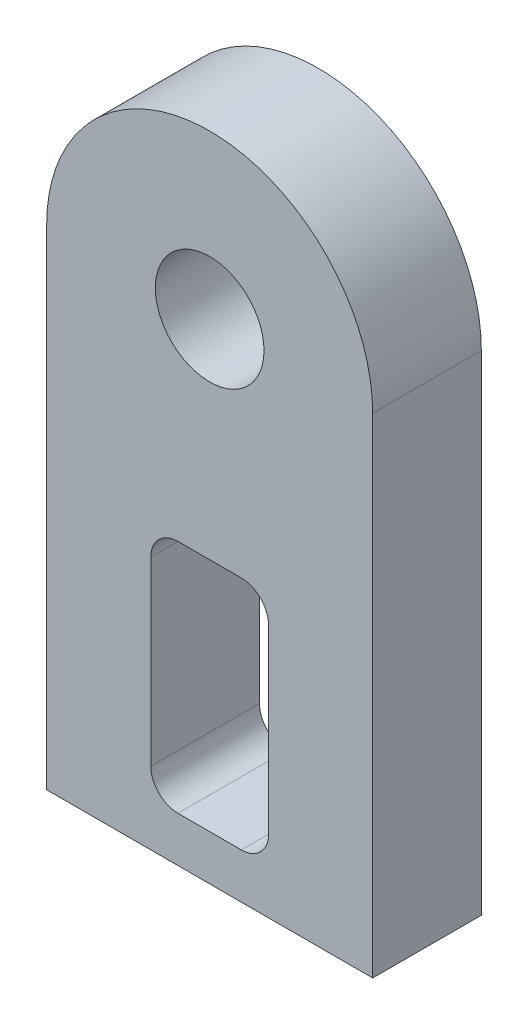
ISO-10303-21;
HEADER;
FILE_DESCRIPTION(('STEP AP214'),'2;1');
FILE_NAME('part.step','',(''),(''),'','','');
FILE_SCHEMA(('AUTOMOTIVE_DESIGN { 1 0 10303 214 1 1 1 1 }'));
ENDSEC;
DATA;
#1=APPLICATION_CONTEXT('core data for automotive mechanical design processes');
#2=APPLICATION_PROTOCOL_DEFINITION('international standard','automotive_design',2000,#1);
#3=PRODUCT_CONTEXT('',#1,'mechanical');
#4=PRODUCT('Part','Part','',(#3));
#5=PRODUCT_RELATED_PRODUCT_CATEGORY('part','',(#4));
#6=PRODUCT_DEFINITION_FORMATION('','',#4);
#7=PRODUCT_DEFINITION_CONTEXT('part definition',#1,'design');
#8=PRODUCT_DEFINITION('design','',#6,#7);
#9=PRODUCT_DEFINITION_SHAPE('','',#8);
#10=(LENGTH_UNIT() NAMED_UNIT(*) SI_UNIT(.MILLI.,.METRE.));
#11=(NAMED_UNIT(*) PLANE_ANGLE_UNIT() SI_UNIT($,.RADIAN.));
#12=(NAMED_UNIT(*) SI_UNIT($,.STERADIAN.) SOLID_ANGLE_UNIT());
#13=UNCERTAINTY_MEASURE_WITH_UNIT(LENGTH_MEASURE(1.E-05),#10,'distance_accuracy_value','');
#14=(GEOMETRIC_REPRESENTATION_CONTEXT(3) GLOBAL_UNCERTAINTY_ASSIGNED_CONTEXT((#13)) GLOBAL_UNIT_ASSIGNED_CONTEXT((#10,
#11,#12)) REPRESENTATION_CONTEXT('',''));
#15=CARTESIAN_POINT('',(0.,0.,0.));
#16=DIRECTION('',(0.,0.,1.));
#17=DIRECTION('',(1.,0.,0.));
#18=AXIS2_PLACEMENT_3D('',#15,#16,#17);
#19=CARTESIAN_POINT('',(155.0913565475,212.4940368431,3.));
#20=DIRECTION('',(0.,0.,1.));
#21=DIRECTION('',(1.,0.,0.));
#22=AXIS2_PLACEMENT_3D('',#19,#20,#21);
#23=PLANE('',#22);
#24=CARTESIAN_POINT('',(155.0913565475,212.4940368431,3.));
#25=DIRECTION('',(0.,0.,1.));
#26=DIRECTION('',(1.,0.,0.));
#27=AXIS2_PLACEMENT_3D('',#24,#25,#26);
#28=CIRCLE('',#27,1.5);
#29=CARTESIAN_POINT('',(156.5913565475,212.4940368431,3.));
#30=VERTEX_POINT('',#29);
#31=EDGE_CURVE('E187',#30,#30,#28,.T.);
#32=ORIENTED_EDGE('',*,*,#31,.F.);
#33=EDGE_LOOP('',(#32));
#34=FACE_BOUND('',#33,.T.);
#35=CARTESIAN_POINT('',(155.0913565475,212.4940368431,3.));
#36=DIRECTION('',(0.,0.,1.));
#37=DIRECTION('',(1.,0.,0.));
#38=AXIS2_PLACEMENT_3D('',#35,#36,#37);
#39=CIRCLE('',#38,4.5);
#40=CARTESIAN_POINT('',(159.5913565475,212.4940368431,3.));
#41=VERTEX_POINT('',#40);
#42=CARTESIAN_POINT('',(150.5913565475,212.4940368431,3.));
#43=VERTEX_POINT('',#42);
#44=EDGE_CURVE('E193',#41,#43,#39,.T.);
#45=ORIENTED_EDGE('',*,*,#44,.T.);
#46=DIRECTION('',(0.,-1.,0.));
#47=VECTOR('',#46,1.);
#48=CARTESIAN_POINT('',(150.5913565475,198.9940368431,3.));
#49=LINE('',#48,#47);
#50=CARTESIAN_POINT('',(150.5913565475,198.9940368431,3.));
#51=VERTEX_POINT('',#50);
#52=EDGE_CURVE('E196',#43,#51,#49,.T.);
#53=ORIENTED_EDGE('',*,*,#52,.T.);
#54=DIRECTION('',(1.,0.,0.));
#55=VECTOR('',#54,1.);
#56=CARTESIAN_POINT('',(159.5913565475,198.9940368431,3.));
#57=LINE('',#56,#55);
#58=CARTESIAN_POINT('',(159.5913565475,198.9940368431,3.));
#59=VERTEX_POINT('',#58);
#60=EDGE_CURVE('E199',#51,#59,#57,.T.);
#61=ORIENTED_EDGE('',*,*,#60,.T.);
#62=DIRECTION('',(0.,1.,0.));
#63=VECTOR('',#62,1.);
#64=CARTESIAN_POINT('',(159.5913565475,212.4940368431,3.));
#65=LINE('',#64,#63);
#66=EDGE_CURVE('E201',#59,#41,#65,.T.);
#67=ORIENTED_EDGE('',*,*,#66,.T.);
#68=EDGE_LOOP('',(#45,#53,#61,#67));
#69=FACE_BOUND('',#68,.T.);
#70=DIRECTION('',(0.,-1.,0.));
#71=VECTOR('',#70,1.);
#72=CARTESIAN_POINT('',(153.4663565475,200.9940368431,3.));
#73=LINE('',#72,#71);
#74=CARTESIAN_POINT('',(153.4663565475,205.9940368431,3.));
#75=VERTEX_POINT('',#74);
#76=CARTESIAN_POINT('',(153.4663565475,200.9940368431,3.));
#77=VERTEX_POINT('',#76);
#78=EDGE_CURVE('E130',#75,#77,#73,.T.);
#79=ORIENTED_EDGE('',*,*,#78,.F.);
#80=CARTESIAN_POINT('',(154.2163565475,205.9940368431,3.));
#81=DIRECTION('',(0.,0.,1.));
#82=DIRECTION('',(1.,0.,0.));
#83=AXIS2_PLACEMENT_3D('',#80,#81,#82);
#84=CIRCLE('',#83,0.750000000000001);
#85=CARTESIAN_POINT('',(154.2163565475,206.7440368431,3.));
#86=VERTEX_POINT('',#85);
#87=EDGE_CURVE('E122',#86,#75,#84,.T.);
#88=ORIENTED_EDGE('',*,*,#87,.F.);
#89=DIRECTION('',(-1.,0.,0.));
#90=VECTOR('',#89,1.);
#91=CARTESIAN_POINT('',(154.2163565475,206.7440368431,3.));
#92=LINE('',#91,#90);
#93=CARTESIAN_POINT('',(155.9663565475,206.7440368431,3.));
#94=VERTEX_POINT('',#93);
#95=EDGE_CURVE('E155',#94,#86,#92,.T.);
#96=ORIENTED_EDGE('',*,*,#95,.F.);
#97=CARTESIAN_POINT('',(155.9663565475,205.9940368431,3.));
#98=DIRECTION('',(0.,0.,1.));
#99=DIRECTION('',(1.,0.,0.));
#100=AXIS2_PLACEMENT_3D('',#97,#98,#99);
#101=CIRCLE('',#100,0.750000000000001);
#102=CARTESIAN_POINT('',(156.7163565475,205.9940368431,3.));
#103=VERTEX_POINT('',#102);
#104=EDGE_CURVE('E153',#103,#94,#101,.T.);
#105=ORIENTED_EDGE('',*,*,#104,.F.);
#106=DIRECTION('',(0.,1.,0.));
#107=VECTOR('',#106,1.);
#108=CARTESIAN_POINT('',(156.7163565475,205.9940368431,3.));
#109=LINE('',#108,#107);
#110=CARTESIAN_POINT('',(156.7163565475,200.9940368431,3.));
#111=VERTEX_POINT('',#110);
#112=EDGE_CURVE('E151',#111,#103,#109,.T.);
#113=ORIENTED_EDGE('',*,*,#112,.F.);
#114=CARTESIAN_POINT('',(155.9663565475,200.9940368431,3.));
#115=DIRECTION('',(0.,0.,1.));
#116=DIRECTION('',(1.,0.,0.));
#117=AXIS2_PLACEMENT_3D('',#114,#115,#116);
#118=CIRCLE('',#117,0.750000000000001);
#119=CARTESIAN_POINT('',(155.9663565475,200.2440368431,3.));
#120=VERTEX_POINT('',#119);
#121=EDGE_CURVE('E149',#120,#111,#118,.T.);
#122=ORIENTED_EDGE('',*,*,#121,.F.);
#123=DIRECTION('',(1.,0.,0.));
#124=VECTOR('',#123,1.);
#125=CARTESIAN_POINT('',(155.9663565475,200.2440368431,3.));
#126=LINE('',#125,#124);
#127=CARTESIAN_POINT('',(154.2163565475,200.2440368431,3.));
#128=VERTEX_POINT('',#127);
#129=EDGE_CURVE('E145',#128,#120,#126,.T.);
#130=ORIENTED_EDGE('',*,*,#129,.F.);
#131=CARTESIAN_POINT('',(154.2163565475,200.9940368431,3.));
#132=DIRECTION('',(0.,0.,1.));
#133=DIRECTION('',(1.,0.,0.));
#134=AXIS2_PLACEMENT_3D('',#131,#132,#133);
#135=CIRCLE('',#134,0.750000000000001);
#136=EDGE_CURVE('E143',#77,#128,#135,.T.);
#137=ORIENTED_EDGE('',*,*,#136,.F.);
#138=EDGE_LOOP('',(#79,#88,#96,#105,#113,#122,#130,#137));
#139=FACE_BOUND('',#138,.T.);
#140=ADVANCED_FACE('F33',(#34,#69,#139),#23,.T.);
#141=CARTESIAN_POINT('',(155.0913565475,212.4940368431,0.));
#142=DIRECTION('',(0.,0.,1.));
#143=DIRECTION('',(1.,0.,0.));
#144=AXIS2_PLACEMENT_3D('',#141,#142,#143);
#145=PLANE('',#144);
#146=CARTESIAN_POINT('',(155.0913565475,212.4940368431,0.));
#147=DIRECTION('',(0.,0.,1.));
#148=DIRECTION('',(1.,0.,0.));
#149=AXIS2_PLACEMENT_3D('',#146,#147,#148);
#150=CIRCLE('',#149,1.5);
#151=CARTESIAN_POINT('',(156.5913565475,212.4940368431,0.));
#152=VERTEX_POINT('',#151);
#153=EDGE_CURVE('E138',#152,#152,#150,.T.);
#154=ORIENTED_EDGE('',*,*,#153,.T.);
#155=EDGE_LOOP('',(#154));
#156=FACE_BOUND('',#155,.T.);
#157=CARTESIAN_POINT('',(155.0913565475,212.4940368431,0.));
#158=DIRECTION('',(0.,0.,1.));
#159=DIRECTION('',(1.,0.,0.));
#160=AXIS2_PLACEMENT_3D('',#157,#158,#159);
#161=CIRCLE('',#160,4.5);
#162=CARTESIAN_POINT('',(159.5913565475,212.4940368431,0.));
#163=VERTEX_POINT('',#162);
#164=CARTESIAN_POINT('',(150.5913565475,212.4940368431,0.));
#165=VERTEX_POINT('',#164);
#166=EDGE_CURVE('E190',#163,#165,#161,.T.);
#167=ORIENTED_EDGE('',*,*,#166,.F.);
#168=DIRECTION('',(0.,1.,0.));
#169=VECTOR('',#168,1.);
#170=CARTESIAN_POINT('',(159.5913565475,212.4940368431,0.));
#171=LINE('',#170,#169);
#172=CARTESIAN_POINT('',(159.5913565475,198.9940368431,0.));
#173=VERTEX_POINT('',#172);
#174=EDGE_CURVE('E197',#173,#163,#171,.T.);
#175=ORIENTED_EDGE('',*,*,#174,.F.);
#176=DIRECTION('',(1.,0.,0.));
#177=VECTOR('',#176,1.);
#178=CARTESIAN_POINT('',(159.5913565475,198.9940368431,0.));
#179=LINE('',#178,#177);
#180=CARTESIAN_POINT('',(150.5913565475,198.9940368431,0.));
#181=VERTEX_POINT('',#180);
#182=EDGE_CURVE('E208',#181,#173,#179,.T.);
#183=ORIENTED_EDGE('',*,*,#182,.F.);
#184=DIRECTION('',(0.,-1.,0.));
#185=VECTOR('',#184,1.);
#186=CARTESIAN_POINT('',(150.5913565475,198.9940368431,0.));
#187=LINE('',#186,#185);
#188=EDGE_CURVE('E206',#165,#181,#187,.T.);
#189=ORIENTED_EDGE('',*,*,#188,.F.);
#190=EDGE_LOOP('',(#167,#175,#183,#189));
#191=FACE_BOUND('',#190,.T.);
#192=CARTESIAN_POINT('',(154.2163565475,205.9940368431,0.));
#193=DIRECTION('',(0.,0.,1.));
#194=DIRECTION('',(1.,0.,0.));
#195=AXIS2_PLACEMENT_3D('',#192,#193,#194);
#196=CIRCLE('',#195,0.750000000000001);
#197=CARTESIAN_POINT('',(154.2163565475,206.7440368431,0.));
#198=VERTEX_POINT('',#197);
#199=CARTESIAN_POINT('',(153.4663565475,205.9940368431,0.));
#200=VERTEX_POINT('',#199);
#201=EDGE_CURVE('E56',#198,#200,#196,.T.);
#202=ORIENTED_EDGE('',*,*,#201,.T.);
#203=DIRECTION('',(0.,-1.,0.));
#204=VECTOR('',#203,1.);
#205=CARTESIAN_POINT('',(153.4663565475,200.9940368431,0.));
#206=LINE('',#205,#204);
#207=CARTESIAN_POINT('',(153.4663565475,200.9940368431,0.));
#208=VERTEX_POINT('',#207);
#209=EDGE_CURVE('E137',#200,#208,#206,.T.);
#210=ORIENTED_EDGE('',*,*,#209,.T.);
#211=CARTESIAN_POINT('',(154.2163565475,200.9940368431,0.));
#212=DIRECTION('',(0.,0.,1.));
#213=DIRECTION('',(1.,0.,0.));
#214=AXIS2_PLACEMENT_3D('',#211,#212,#213);
#215=CIRCLE('',#214,0.750000000000001);
#216=CARTESIAN_POINT('',(154.2163565475,200.2440368431,0.));
#217=VERTEX_POINT('',#216);
#218=EDGE_CURVE('E159',#208,#217,#215,.T.);
#219=ORIENTED_EDGE('',*,*,#218,.T.);
#220=DIRECTION('',(1.,0.,0.));
#221=VECTOR('',#220,1.);
#222=CARTESIAN_POINT('',(155.9663565475,200.2440368431,0.));
#223=LINE('',#222,#221);
#224=CARTESIAN_POINT('',(155.9663565475,200.2440368431,0.));
#225=VERTEX_POINT('',#224);
#226=EDGE_CURVE('E162',#217,#225,#223,.T.);
#227=ORIENTED_EDGE('',*,*,#226,.T.);
#228=CARTESIAN_POINT('',(155.9663565475,200.9940368431,0.));
#229=DIRECTION('',(0.,0.,1.));
#230=DIRECTION('',(1.,0.,0.));
#231=AXIS2_PLACEMENT_3D('',#228,#229,#230);
#232=CIRCLE('',#231,0.750000000000001);
#233=CARTESIAN_POINT('',(156.7163565475,200.9940368431,0.));
#234=VERTEX_POINT('',#233);
#235=EDGE_CURVE('E165',#225,#234,#232,.T.);
#236=ORIENTED_EDGE('',*,*,#235,.T.);
#237=DIRECTION('',(0.,1.,0.));
#238=VECTOR('',#237,1.);
#239=CARTESIAN_POINT('',(156.7163565475,205.9940368431,0.));
#240=LINE('',#239,#238);
#241=CARTESIAN_POINT('',(156.7163565475,205.9940368431,0.));
#242=VERTEX_POINT('',#241);
#243=EDGE_CURVE('E168',#234,#242,#240,.T.);
#244=ORIENTED_EDGE('',*,*,#243,.T.);
#245=CARTESIAN_POINT('',(155.9663565475,205.9940368431,0.));
#246=DIRECTION('',(0.,0.,1.));
#247=DIRECTION('',(1.,0.,0.));
#248=AXIS2_PLACEMENT_3D('',#245,#246,#247);
#249=CIRCLE('',#248,0.750000000000001);
#250=CARTESIAN_POINT('',(155.9663565475,206.7440368431,0.));
#251=VERTEX_POINT('',#250);
#252=EDGE_CURVE('E171',#242,#251,#249,.T.);
#253=ORIENTED_EDGE('',*,*,#252,.T.);
#254=DIRECTION('',(-1.,0.,0.));
#255=VECTOR('',#254,1.);
#256=CARTESIAN_POINT('',(154.2163565475,206.7440368431,0.));
#257=LINE('',#256,#255);
#258=EDGE_CURVE('E131',#251,#198,#257,.T.);
#259=ORIENTED_EDGE('',*,*,#258,.T.);
#260=EDGE_LOOP('',(#202,#210,#219,#227,#236,#244,#253,#259));
#261=FACE_BOUND('',#260,.T.);
#262=ADVANCED_FACE('F226',(#156,#191,#261),#145,.F.);
#263=CARTESIAN_POINT('',(155.0913565475,212.4940368431,3.));
#264=DIRECTION('',(0.,0.,-1.));
#265=DIRECTION('',(-1.,0.,0.));
#266=AXIS2_PLACEMENT_3D('',#263,#264,#265);
#267=CYLINDRICAL_SURFACE('',#266,4.5);
#268=ORIENTED_EDGE('',*,*,#166,.T.);
#269=DIRECTION('',(0.,0.,-1.));
#270=VECTOR('',#269,1.);
#271=CARTESIAN_POINT('',(150.5913565475,212.4940368431,3.));
#272=LINE('',#271,#270);
#273=EDGE_CURVE('E11',#43,#165,#272,.T.);
#274=ORIENTED_EDGE('',*,*,#273,.F.);
#275=ORIENTED_EDGE('',*,*,#44,.F.);
#276=DIRECTION('',(0.,0.,-1.));
#277=VECTOR('',#276,1.);
#278=CARTESIAN_POINT('',(159.5913565475,212.4940368431,3.));
#279=LINE('',#278,#277);
#280=EDGE_CURVE('E203',#41,#163,#279,.T.);
#281=ORIENTED_EDGE('',*,*,#280,.T.);
#282=EDGE_LOOP('',(#268,#274,#275,#281));
#283=FACE_BOUND('',#282,.T.);
#284=ADVANCED_FACE('F35',(#283),#267,.T.);
#285=CARTESIAN_POINT('',(150.5913565475,198.9940368431,3.));
#286=DIRECTION('',(1.,0.,0.));
#287=DIRECTION('',(0.,0.,-1.));
#288=AXIS2_PLACEMENT_3D('',#285,#286,#287);
#289=PLANE('',#288);
#290=ORIENTED_EDGE('',*,*,#188,.T.);
#291=DIRECTION('',(0.,0.,-1.));
#292=VECTOR('',#291,1.);
#293=CARTESIAN_POINT('',(150.5913565475,198.9940368431,3.));
#294=LINE('',#293,#292);
#295=EDGE_CURVE('E41',#51,#181,#294,.T.);
#296=ORIENTED_EDGE('',*,*,#295,.F.);
#297=ORIENTED_EDGE('',*,*,#52,.F.);
#298=ORIENTED_EDGE('',*,*,#273,.T.);
#299=EDGE_LOOP('',(#290,#296,#297,#298));
#300=FACE_BOUND('',#299,.T.);
#301=ADVANCED_FACE('F236',(#300),#289,.F.);
#302=CARTESIAN_POINT('',(159.5913565475,198.9940368431,3.));
#303=DIRECTION('',(0.,1.,0.));
#304=DIRECTION('',(0.,0.,1.));
#305=AXIS2_PLACEMENT_3D('',#302,#303,#304);
#306=PLANE('',#305);
#307=ORIENTED_EDGE('',*,*,#182,.T.);
#308=DIRECTION('',(0.,0.,-1.));
#309=VECTOR('',#308,1.);
#310=CARTESIAN_POINT('',(159.5913565475,198.9940368431,3.));
#311=LINE('',#310,#309);
#312=EDGE_CURVE('E213',#59,#173,#311,.T.);
#313=ORIENTED_EDGE('',*,*,#312,.F.);
#314=ORIENTED_EDGE('',*,*,#60,.F.);
#315=ORIENTED_EDGE('',*,*,#295,.T.);
#316=EDGE_LOOP('',(#307,#313,#314,#315));
#317=FACE_BOUND('',#316,.T.);
#318=ADVANCED_FACE('F220',(#317),#306,.F.);
#319=CARTESIAN_POINT('',(159.5913565475,212.4940368431,3.));
#320=DIRECTION('',(-1.,0.,0.));
#321=DIRECTION('',(0.,0.,1.));
#322=AXIS2_PLACEMENT_3D('',#319,#320,#321);
#323=PLANE('',#322);
#324=ORIENTED_EDGE('',*,*,#174,.T.);
#325=ORIENTED_EDGE('',*,*,#280,.F.);
#326=ORIENTED_EDGE('',*,*,#66,.F.);
#327=ORIENTED_EDGE('',*,*,#312,.T.);
#328=EDGE_LOOP('',(#324,#325,#326,#327));
#329=FACE_BOUND('',#328,.T.);
#330=ADVANCED_FACE('F230',(#329),#323,.F.);
#331=CARTESIAN_POINT('',(155.0913565475,212.4940368431,3.));
#332=DIRECTION('',(0.,0.,-1.));
#333=DIRECTION('',(-1.,0.,0.));
#334=AXIS2_PLACEMENT_3D('',#331,#332,#333);
#335=CYLINDRICAL_SURFACE('',#334,1.5);
#336=ORIENTED_EDGE('',*,*,#31,.T.);
#337=EDGE_LOOP('',(#336));
#338=FACE_BOUND('',#337,.T.);
#339=ORIENTED_EDGE('',*,*,#153,.F.);
#340=EDGE_LOOP('',(#339));
#341=FACE_BOUND('',#340,.T.);
#342=ADVANCED_FACE('F253',(#338,#341),#335,.F.);
#343=CARTESIAN_POINT('',(154.2163565475,205.9940368431,3.));
#344=DIRECTION('',(0.,0.,-1.));
#345=DIRECTION('',(-1.,0.,0.));
#346=AXIS2_PLACEMENT_3D('',#343,#344,#345);
#347=CYLINDRICAL_SURFACE('',#346,0.750000000000001);
#348=ORIENTED_EDGE('',*,*,#201,.F.);
#349=DIRECTION('',(0.,0.,-1.));
#350=VECTOR('',#349,1.);
#351=CARTESIAN_POINT('',(154.2163565475,206.7440368431,3.));
#352=LINE('',#351,#350);
#353=EDGE_CURVE('E126',#86,#198,#352,.T.);
#354=ORIENTED_EDGE('',*,*,#353,.F.);
#355=ORIENTED_EDGE('',*,*,#87,.T.);
#356=DIRECTION('',(0.,0.,-1.));
#357=VECTOR('',#356,1.);
#358=CARTESIAN_POINT('',(153.4663565475,205.9940368431,3.));
#359=LINE('',#358,#357);
#360=EDGE_CURVE('E125',#75,#200,#359,.T.);
#361=ORIENTED_EDGE('',*,*,#360,.T.);
#362=EDGE_LOOP('',(#348,#354,#355,#361));
#363=FACE_BOUND('',#362,.T.);
#364=ADVANCED_FACE('F124',(#363),#347,.F.);
#365=CARTESIAN_POINT('',(153.4663565475,200.9940368431,3.));
#366=DIRECTION('',(1.,0.,0.));
#367=DIRECTION('',(0.,0.,-1.));
#368=AXIS2_PLACEMENT_3D('',#365,#366,#367);
#369=PLANE('',#368);
#370=ORIENTED_EDGE('',*,*,#209,.F.);
#371=ORIENTED_EDGE('',*,*,#360,.F.);
#372=ORIENTED_EDGE('',*,*,#78,.T.);
#373=DIRECTION('',(0.,0.,-1.));
#374=VECTOR('',#373,1.);
#375=CARTESIAN_POINT('',(153.4663565475,200.9940368431,3.));
#376=LINE('',#375,#374);
#377=EDGE_CURVE('E139',#77,#208,#376,.T.);
#378=ORIENTED_EDGE('',*,*,#377,.T.);
#379=EDGE_LOOP('',(#370,#371,#372,#378));
#380=FACE_BOUND('',#379,.T.);
#381=ADVANCED_FACE('F134',(#380),#369,.T.);
#382=CARTESIAN_POINT('',(154.2163565475,200.9940368431,3.));
#383=DIRECTION('',(0.,0.,-1.));
#384=DIRECTION('',(-1.,0.,0.));
#385=AXIS2_PLACEMENT_3D('',#382,#383,#384);
#386=CYLINDRICAL_SURFACE('',#385,0.750000000000001);
#387=ORIENTED_EDGE('',*,*,#218,.F.);
#388=ORIENTED_EDGE('',*,*,#377,.F.);
#389=ORIENTED_EDGE('',*,*,#136,.T.);
#390=DIRECTION('',(0.,0.,-1.));
#391=VECTOR('',#390,1.);
#392=CARTESIAN_POINT('',(154.2163565475,200.2440368431,3.));
#393=LINE('',#392,#391);
#394=EDGE_CURVE('E184',#128,#217,#393,.T.);
#395=ORIENTED_EDGE('',*,*,#394,.T.);
#396=EDGE_LOOP('',(#387,#388,#389,#395));
#397=FACE_BOUND('',#396,.T.);
#398=ADVANCED_FACE('F269',(#397),#386,.F.);
#399=CARTESIAN_POINT('',(155.9663565475,200.2440368431,3.));
#400=DIRECTION('',(0.,1.,0.));
#401=DIRECTION('',(0.,0.,1.));
#402=AXIS2_PLACEMENT_3D('',#399,#400,#401);
#403=PLANE('',#402);
#404=ORIENTED_EDGE('',*,*,#226,.F.);
#405=ORIENTED_EDGE('',*,*,#394,.F.);
#406=ORIENTED_EDGE('',*,*,#129,.T.);
#407=DIRECTION('',(0.,0.,-1.));
#408=VECTOR('',#407,1.);
#409=CARTESIAN_POINT('',(155.9663565475,200.2440368431,3.));
#410=LINE('',#409,#408);
#411=EDGE_CURVE('E182',#120,#225,#410,.T.);
#412=ORIENTED_EDGE('',*,*,#411,.T.);
#413=EDGE_LOOP('',(#404,#405,#406,#412));
#414=FACE_BOUND('',#413,.T.);
#415=ADVANCED_FACE('F274',(#414),#403,.T.);
#416=CARTESIAN_POINT('',(155.9663565475,200.9940368431,3.));
#417=DIRECTION('',(0.,0.,-1.));
#418=DIRECTION('',(-1.,0.,0.));
#419=AXIS2_PLACEMENT_3D('',#416,#417,#418);
#420=CYLINDRICAL_SURFACE('',#419,0.750000000000001);
#421=ORIENTED_EDGE('',*,*,#235,.F.);
#422=ORIENTED_EDGE('',*,*,#411,.F.);
#423=ORIENTED_EDGE('',*,*,#121,.T.);
#424=DIRECTION('',(0.,0.,-1.));
#425=VECTOR('',#424,1.);
#426=CARTESIAN_POINT('',(156.7163565475,200.9940368431,3.));
#427=LINE('',#426,#425);
#428=EDGE_CURVE('E180',#111,#234,#427,.T.);
#429=ORIENTED_EDGE('',*,*,#428,.T.);
#430=EDGE_LOOP('',(#421,#422,#423,#429));
#431=FACE_BOUND('',#430,.T.);
#432=ADVANCED_FACE('F278',(#431),#420,.F.);
#433=CARTESIAN_POINT('',(156.7163565475,205.9940368431,3.));
#434=DIRECTION('',(-1.,0.,0.));
#435=DIRECTION('',(0.,0.,1.));
#436=AXIS2_PLACEMENT_3D('',#433,#434,#435);
#437=PLANE('',#436);
#438=ORIENTED_EDGE('',*,*,#243,.F.);
#439=ORIENTED_EDGE('',*,*,#428,.F.);
#440=ORIENTED_EDGE('',*,*,#112,.T.);
#441=DIRECTION('',(0.,0.,-1.));
#442=VECTOR('',#441,1.);
#443=CARTESIAN_POINT('',(156.7163565475,205.9940368431,3.));
#444=LINE('',#443,#442);
#445=EDGE_CURVE('E178',#103,#242,#444,.T.);
#446=ORIENTED_EDGE('',*,*,#445,.T.);
#447=EDGE_LOOP('',(#438,#439,#440,#446));
#448=FACE_BOUND('',#447,.T.);
#449=ADVANCED_FACE('F282',(#448),#437,.T.);
#450=CARTESIAN_POINT('',(155.9663565475,205.9940368431,3.));
#451=DIRECTION('',(0.,0.,-1.));
#452=DIRECTION('',(-1.,0.,0.));
#453=AXIS2_PLACEMENT_3D('',#450,#451,#452);
#454=CYLINDRICAL_SURFACE('',#453,0.750000000000001);
#455=ORIENTED_EDGE('',*,*,#252,.F.);
#456=ORIENTED_EDGE('',*,*,#445,.F.);
#457=ORIENTED_EDGE('',*,*,#104,.T.);
#458=DIRECTION('',(0.,0.,-1.));
#459=VECTOR('',#458,1.);
#460=CARTESIAN_POINT('',(155.9663565475,206.7440368431,3.));
#461=LINE('',#460,#459);
#462=EDGE_CURVE('E48',#94,#251,#461,.T.);
#463=ORIENTED_EDGE('',*,*,#462,.T.);
#464=EDGE_LOOP('',(#455,#456,#457,#463));
#465=FACE_BOUND('',#464,.T.);
#466=ADVANCED_FACE('F286',(#465),#454,.F.);
#467=CARTESIAN_POINT('',(154.2163565475,206.7440368431,3.));
#468=DIRECTION('',(0.,-1.,0.));
#469=DIRECTION('',(0.,0.,-1.));
#470=AXIS2_PLACEMENT_3D('',#467,#468,#469);
#471=PLANE('',#470);
#472=ORIENTED_EDGE('',*,*,#258,.F.);
#473=ORIENTED_EDGE('',*,*,#462,.F.);
#474=ORIENTED_EDGE('',*,*,#95,.T.);
#475=ORIENTED_EDGE('',*,*,#353,.T.);
#476=EDGE_LOOP('',(#472,#473,#474,#475));
#477=FACE_BOUND('',#476,.T.);
#478=ADVANCED_FACE('F290',(#477),#471,.T.);
#479=CLOSED_SHELL('',(#140,#262,#284,#301,#318,#330,#342,#364,#381,#398,#415,#432,#449,#466,#478));
#480=MANIFOLD_SOLID_BREP('B2',#479);
#481=ADVANCED_BREP_SHAPE_REPRESENTATION('',(#18,#480),#14);
#482=SHAPE_DEFINITION_REPRESENTATION(#9,#481);
ENDSEC;
END-ISO-10303-21;
